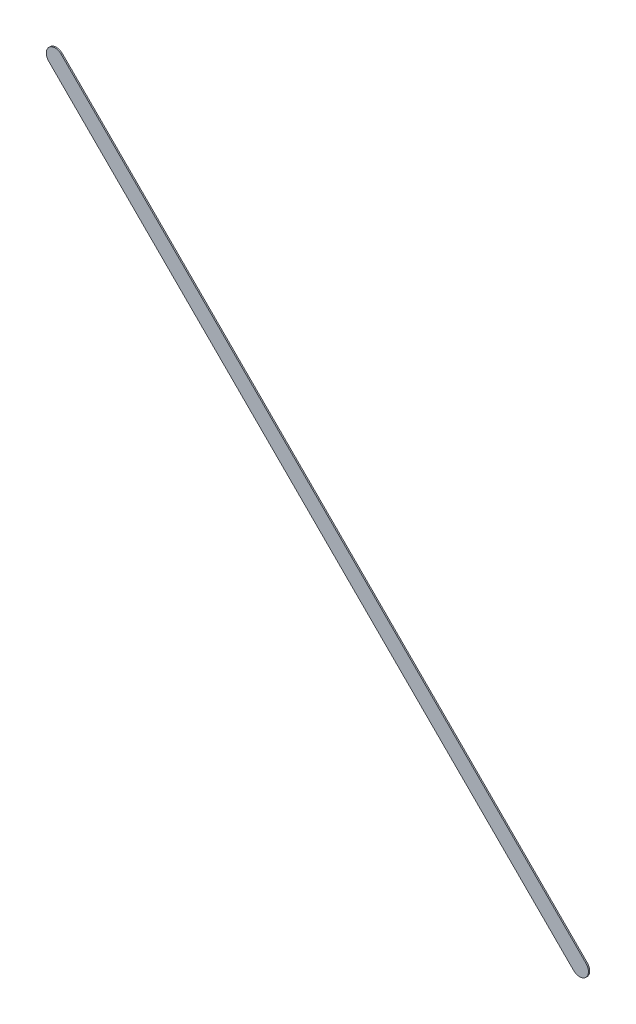
ISO-10303-21;
HEADER;
FILE_DESCRIPTION(('STEP AP214'),'2;1');
FILE_NAME('part.step','',(''),(''),'','','');
FILE_SCHEMA(('AUTOMOTIVE_DESIGN { 1 0 10303 214 1 1 1 1 }'));
ENDSEC;
DATA;
#1=APPLICATION_CONTEXT('core data for automotive mechanical design processes');
#2=APPLICATION_PROTOCOL_DEFINITION('international standard','automotive_design',2000,#1);
#3=PRODUCT_CONTEXT('',#1,'mechanical');
#4=PRODUCT('Part','Part','',(#3));
#5=PRODUCT_RELATED_PRODUCT_CATEGORY('part','',(#4));
#6=PRODUCT_DEFINITION_FORMATION('','',#4);
#7=PRODUCT_DEFINITION_CONTEXT('part definition',#1,'design');
#8=PRODUCT_DEFINITION('design','',#6,#7);
#9=PRODUCT_DEFINITION_SHAPE('','',#8);
#10=(LENGTH_UNIT() NAMED_UNIT(*) SI_UNIT(.MILLI.,.METRE.));
#11=(NAMED_UNIT(*) PLANE_ANGLE_UNIT() SI_UNIT($,.RADIAN.));
#12=(NAMED_UNIT(*) SI_UNIT($,.STERADIAN.) SOLID_ANGLE_UNIT());
#13=UNCERTAINTY_MEASURE_WITH_UNIT(LENGTH_MEASURE(1.E-05),#10,'distance_accuracy_value','');
#14=(GEOMETRIC_REPRESENTATION_CONTEXT(3) GLOBAL_UNCERTAINTY_ASSIGNED_CONTEXT((#13)) GLOBAL_UNIT_ASSIGNED_CONTEXT((#10,
#11,#12)) REPRESENTATION_CONTEXT('',''));
#15=CARTESIAN_POINT('',(0.,0.,0.));
#16=DIRECTION('',(0.,0.,1.));
#17=DIRECTION('',(1.,0.,0.));
#18=AXIS2_PLACEMENT_3D('',#15,#16,#17);
#19=CARTESIAN_POINT('',(63.52611882,82.08666082,0.));
#20=DIRECTION('',(0.707105582266632,0.70710798010443,0.));
#21=DIRECTION('',(0.70710798010443,-0.707105582266632,0.));
#22=AXIS2_PLACEMENT_3D('',#19,#20,#21);
#23=PLANE('',#22);
#24=DIRECTION('',(0.70710798010443,-0.707105582266632,0.));
#25=VECTOR('',#24,1.);
#26=CARTESIAN_POINT('',(63.52611882,82.08666082,0.03556));
#27=LINE('',#26,#25);
#28=CARTESIAN_POINT('',(63.52611882,82.08666082,0.03556));
#29=VERTEX_POINT('',#28);
#30=CARTESIAN_POINT('',(78.50673402,67.10609642,0.03556));
#31=VERTEX_POINT('',#30);
#32=EDGE_CURVE('E11',#29,#31,#27,.T.);
#33=ORIENTED_EDGE('',*,*,#32,.F.);
#34=DIRECTION('',(0.,0.,1.));
#35=VECTOR('',#34,1.);
#36=CARTESIAN_POINT('',(63.52611882,82.08666082,0.));
#37=LINE('',#36,#35);
#38=CARTESIAN_POINT('',(63.52611882,82.08666082,0.));
#39=VERTEX_POINT('',#38);
#40=EDGE_CURVE('E24',#39,#29,#37,.T.);
#41=ORIENTED_EDGE('',*,*,#40,.F.);
#42=DIRECTION('',(0.70710798010443,-0.707105582266632,0.));
#43=VECTOR('',#42,1.);
#44=CARTESIAN_POINT('',(63.52611882,82.08666082,0.));
#45=LINE('',#44,#43);
#46=CARTESIAN_POINT('',(78.50673402,67.10609642,0.));
#47=VERTEX_POINT('',#46);
#48=EDGE_CURVE('E75',#39,#47,#45,.T.);
#49=ORIENTED_EDGE('',*,*,#48,.T.);
#50=DIRECTION('',(0.,0.,1.));
#51=VECTOR('',#50,1.);
#52=CARTESIAN_POINT('',(78.50673402,67.10609642,0.));
#53=LINE('',#52,#51);
#54=EDGE_CURVE('E37',#47,#31,#53,.T.);
#55=ORIENTED_EDGE('',*,*,#54,.T.);
#56=EDGE_LOOP('',(#33,#41,#49,#55));
#57=FACE_BOUND('',#56,.T.);
#58=ADVANCED_FACE('F17',(#57),#23,.F.);
#59=CARTESIAN_POINT('',(78.6835104,67.2828728,0.));
#60=DIRECTION('',(0.,0.,-1.));
#61=DIRECTION('',(-0.707106781186519,-0.707106781186576,0.));
#62=AXIS2_PLACEMENT_3D('',#59,#60,#61);
#63=CYLINDRICAL_SURFACE('',#62,0.249999554103226);
#64=CARTESIAN_POINT('',(78.6835104,67.2828728,0.03556));
#65=DIRECTION('',(0.,0.,1.));
#66=DIRECTION('',(-0.707106781186519,-0.707106781186576,0.));
#67=AXIS2_PLACEMENT_3D('',#64,#65,#66);
#68=CIRCLE('',#67,0.249999554103226);
#69=CARTESIAN_POINT('',(78.86028678,67.45964918,0.03556));
#70=VERTEX_POINT('',#69);
#71=EDGE_CURVE('E83',#31,#70,#68,.T.);
#72=ORIENTED_EDGE('',*,*,#71,.F.);
#73=ORIENTED_EDGE('',*,*,#54,.F.);
#74=CARTESIAN_POINT('',(78.6835104,67.2828728,0.));
#75=DIRECTION('',(0.,0.,1.));
#76=DIRECTION('',(-0.707106781186519,-0.707106781186576,0.));
#77=AXIS2_PLACEMENT_3D('',#74,#75,#76);
#78=CIRCLE('',#77,0.249999554103226);
#79=CARTESIAN_POINT('',(78.86028678,67.45964918,0.));
#80=VERTEX_POINT('',#79);
#81=EDGE_CURVE('E81',#47,#80,#78,.T.);
#82=ORIENTED_EDGE('',*,*,#81,.T.);
#83=DIRECTION('',(0.,0.,1.));
#84=VECTOR('',#83,1.);
#85=CARTESIAN_POINT('',(78.86028678,67.45964918,0.));
#86=LINE('',#85,#84);
#87=EDGE_CURVE('E67',#80,#70,#86,.T.);
#88=ORIENTED_EDGE('',*,*,#87,.T.);
#89=EDGE_LOOP('',(#72,#73,#82,#88));
#90=FACE_BOUND('',#89,.T.);
#91=ADVANCED_FACE('F89',(#90),#63,.T.);
#92=CARTESIAN_POINT('',(78.86028678,67.45964918,0.));
#93=DIRECTION('',(-0.707105582266631,-0.707107980104431,0.));
#94=DIRECTION('',(-0.707107980104431,0.707105582266631,0.));
#95=AXIS2_PLACEMENT_3D('',#92,#93,#94);
#96=PLANE('',#95);
#97=DIRECTION('',(-0.707107980104431,0.707105582266631,0.));
#98=VECTOR('',#97,1.);
#99=CARTESIAN_POINT('',(78.86028678,67.45964918,0.03556));
#100=LINE('',#99,#98);
#101=CARTESIAN_POINT('',(63.87967158,82.44021358,0.03556));
#102=VERTEX_POINT('',#101);
#103=EDGE_CURVE('E71',#70,#102,#100,.T.);
#104=ORIENTED_EDGE('',*,*,#103,.F.);
#105=ORIENTED_EDGE('',*,*,#87,.F.);
#106=DIRECTION('',(-0.707107980104431,0.707105582266631,0.));
#107=VECTOR('',#106,1.);
#108=CARTESIAN_POINT('',(78.86028678,67.45964918,0.));
#109=LINE('',#108,#107);
#110=CARTESIAN_POINT('',(63.87967158,82.44021358,0.));
#111=VERTEX_POINT('',#110);
#112=EDGE_CURVE('E63',#80,#111,#109,.T.);
#113=ORIENTED_EDGE('',*,*,#112,.T.);
#114=DIRECTION('',(0.,0.,1.));
#115=VECTOR('',#114,1.);
#116=CARTESIAN_POINT('',(63.87967158,82.44021358,0.));
#117=LINE('',#116,#115);
#118=EDGE_CURVE('E53',#111,#102,#117,.T.);
#119=ORIENTED_EDGE('',*,*,#118,.T.);
#120=EDGE_LOOP('',(#104,#105,#113,#119));
#121=FACE_BOUND('',#120,.T.);
#122=ADVANCED_FACE('F66',(#121),#96,.F.);
#123=CARTESIAN_POINT('',(63.7028952,82.2634372,0.));
#124=DIRECTION('',(0.,0.,-1.));
#125=DIRECTION('',(0.707106781186562,0.707106781186533,0.));
#126=AXIS2_PLACEMENT_3D('',#123,#124,#125);
#127=CYLINDRICAL_SURFACE('',#126,0.249999554103215);
#128=CARTESIAN_POINT('',(63.7028952,82.2634372,0.03556));
#129=DIRECTION('',(0.,0.,1.));
#130=DIRECTION('',(0.707106781186562,0.707106781186533,0.));
#131=AXIS2_PLACEMENT_3D('',#128,#129,#130);
#132=CIRCLE('',#131,0.249999554103215);
#133=EDGE_CURVE('E59',#102,#29,#132,.T.);
#134=ORIENTED_EDGE('',*,*,#133,.F.);
#135=ORIENTED_EDGE('',*,*,#118,.F.);
#136=CARTESIAN_POINT('',(63.7028952,82.2634372,0.));
#137=DIRECTION('',(0.,0.,1.));
#138=DIRECTION('',(0.707106781186562,0.707106781186533,0.));
#139=AXIS2_PLACEMENT_3D('',#136,#137,#138);
#140=CIRCLE('',#139,0.249999554103215);
#141=EDGE_CURVE('E57',#111,#39,#140,.T.);
#142=ORIENTED_EDGE('',*,*,#141,.T.);
#143=ORIENTED_EDGE('',*,*,#40,.T.);
#144=EDGE_LOOP('',(#134,#135,#142,#143));
#145=FACE_BOUND('',#144,.T.);
#146=ADVANCED_FACE('F55',(#145),#127,.T.);
#147=CARTESIAN_POINT('',(63.52611882,82.08666082,0.));
#148=DIRECTION('',(0.,0.,-1.));
#149=DIRECTION('',(-1.,0.,0.));
#150=AXIS2_PLACEMENT_3D('',#147,#148,#149);
#151=PLANE('',#150);
#152=ORIENTED_EDGE('',*,*,#141,.F.);
#153=ORIENTED_EDGE('',*,*,#112,.F.);
#154=ORIENTED_EDGE('',*,*,#81,.F.);
#155=ORIENTED_EDGE('',*,*,#48,.F.);
#156=EDGE_LOOP('',(#152,#153,#154,#155));
#157=FACE_BOUND('',#156,.T.);
#158=ADVANCED_FACE('F74',(#157),#151,.T.);
#159=CARTESIAN_POINT('',(63.52611882,82.08666082,0.03556));
#160=DIRECTION('',(0.,0.,-1.));
#161=DIRECTION('',(-1.,0.,0.));
#162=AXIS2_PLACEMENT_3D('',#159,#160,#161);
#163=PLANE('',#162);
#164=ORIENTED_EDGE('',*,*,#32,.T.);
#165=ORIENTED_EDGE('',*,*,#71,.T.);
#166=ORIENTED_EDGE('',*,*,#103,.T.);
#167=ORIENTED_EDGE('',*,*,#133,.T.);
#168=EDGE_LOOP('',(#164,#165,#166,#167));
#169=FACE_BOUND('',#168,.T.);
#170=ADVANCED_FACE('F91',(#169),#163,.F.);
#171=CLOSED_SHELL('',(#58,#91,#122,#146,#158,#170));
#172=MANIFOLD_SOLID_BREP('B1',#171);
#173=ADVANCED_BREP_SHAPE_REPRESENTATION('',(#18,#172),#14);
#174=SHAPE_DEFINITION_REPRESENTATION(#9,#173);
ENDSEC;
END-ISO-10303-21;
